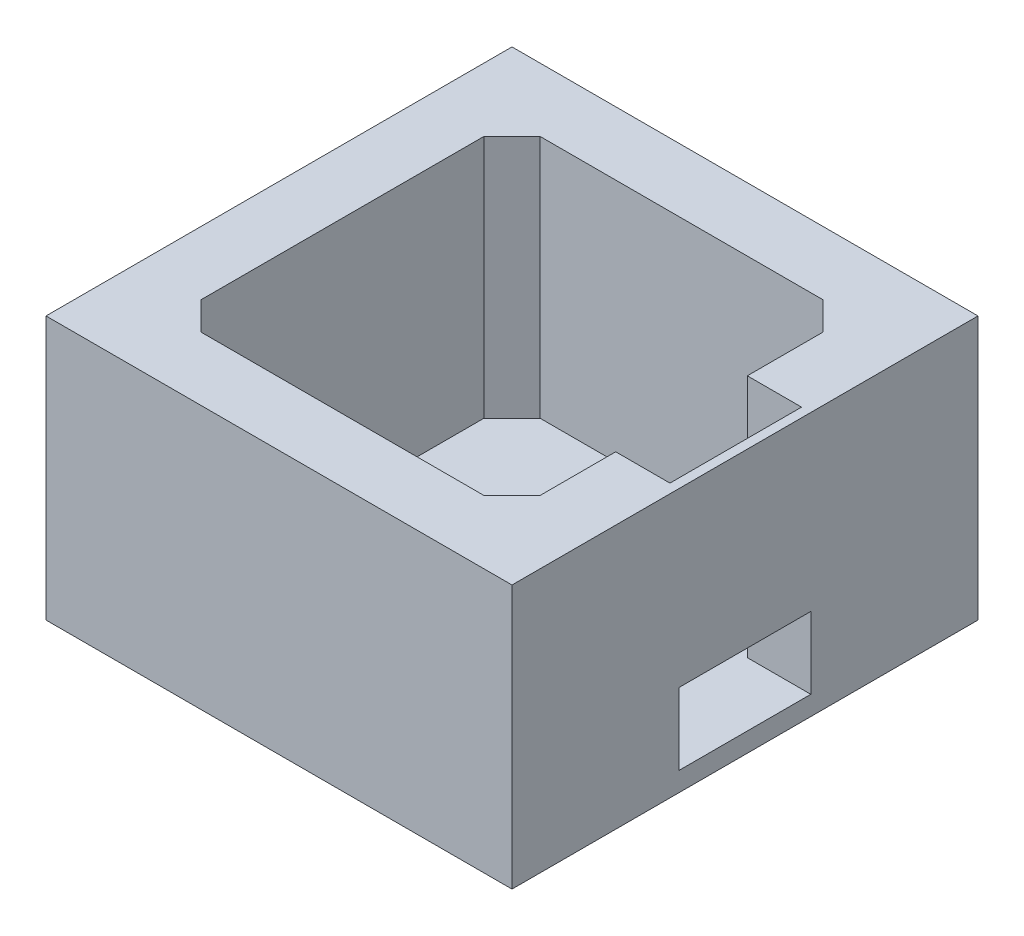
ISO-10303-21;
HEADER;
FILE_DESCRIPTION(('STEP AP214'),'2;1');
FILE_NAME('part.step','',(''),(''),'','','');
FILE_SCHEMA(('AUTOMOTIVE_DESIGN { 1 0 10303 214 1 1 1 1 }'));
ENDSEC;
DATA;
#1=APPLICATION_CONTEXT('core data for automotive mechanical design processes');
#2=APPLICATION_PROTOCOL_DEFINITION('international standard','automotive_design',2000,#1);
#3=PRODUCT_CONTEXT('',#1,'mechanical');
#4=PRODUCT('Part','Part','',(#3));
#5=PRODUCT_RELATED_PRODUCT_CATEGORY('part','',(#4));
#6=PRODUCT_DEFINITION_FORMATION('','',#4);
#7=PRODUCT_DEFINITION_CONTEXT('part definition',#1,'design');
#8=PRODUCT_DEFINITION('design','',#6,#7);
#9=PRODUCT_DEFINITION_SHAPE('','',#8);
#10=(LENGTH_UNIT() NAMED_UNIT(*) SI_UNIT(.MILLI.,.METRE.));
#11=(NAMED_UNIT(*) PLANE_ANGLE_UNIT() SI_UNIT($,.RADIAN.));
#12=(NAMED_UNIT(*) SI_UNIT($,.STERADIAN.) SOLID_ANGLE_UNIT());
#13=UNCERTAINTY_MEASURE_WITH_UNIT(LENGTH_MEASURE(1.E-05),#10,'distance_accuracy_value','');
#14=(GEOMETRIC_REPRESENTATION_CONTEXT(3) GLOBAL_UNCERTAINTY_ASSIGNED_CONTEXT((#13)) GLOBAL_UNIT_ASSIGNED_CONTEXT((#10,
#11,#12)) REPRESENTATION_CONTEXT('',''));
#15=CARTESIAN_POINT('',(0.,0.,0.));
#16=DIRECTION('',(0.,0.,1.));
#17=DIRECTION('',(1.,0.,0.));
#18=AXIS2_PLACEMENT_3D('',#15,#16,#17);
#19=CARTESIAN_POINT('',(0.,33.02,0.));
#20=DIRECTION('',(1.,0.,0.));
#21=DIRECTION('',(0.,0.,-1.));
#22=AXIS2_PLACEMENT_3D('',#19,#20,#21);
#23=PLANE('',#22);
#24=DIRECTION('',(0.,0.,1.));
#25=VECTOR('',#24,1.);
#26=CARTESIAN_POINT('',(0.,0.,0.));
#27=LINE('',#26,#25);
#28=CARTESIAN_POINT('',(0.,0.,-58.42));
#29=VERTEX_POINT('',#28);
#30=CARTESIAN_POINT('',(0.,0.,0.));
#31=VERTEX_POINT('',#30);
#32=EDGE_CURVE('E291',#29,#31,#27,.T.);
#33=ORIENTED_EDGE('',*,*,#32,.T.);
#34=DIRECTION('',(0.,-1.,0.));
#35=VECTOR('',#34,1.);
#36=CARTESIAN_POINT('',(0.,33.02,0.));
#37=LINE('',#36,#35);
#38=CARTESIAN_POINT('',(0.,33.02,0.));
#39=VERTEX_POINT('',#38);
#40=EDGE_CURVE('E11',#39,#31,#37,.T.);
#41=ORIENTED_EDGE('',*,*,#40,.F.);
#42=DIRECTION('',(0.,0.,1.));
#43=VECTOR('',#42,1.);
#44=CARTESIAN_POINT('',(0.,33.02,0.));
#45=LINE('',#44,#43);
#46=CARTESIAN_POINT('',(0.,33.02,-58.42));
#47=VERTEX_POINT('',#46);
#48=EDGE_CURVE('E323',#47,#39,#45,.T.);
#49=ORIENTED_EDGE('',*,*,#48,.F.);
#50=DIRECTION('',(0.,-1.,0.));
#51=VECTOR('',#50,1.);
#52=CARTESIAN_POINT('',(0.,33.02,-58.42));
#53=LINE('',#52,#51);
#54=EDGE_CURVE('E337',#47,#29,#53,.T.);
#55=ORIENTED_EDGE('',*,*,#54,.T.);
#56=EDGE_LOOP('',(#33,#41,#49,#55));
#57=FACE_BOUND('',#56,.T.);
#58=ADVANCED_FACE('F39',(#57),#23,.F.);
#59=CARTESIAN_POINT('',(0.,33.02,0.));
#60=DIRECTION('',(0.,0.,-1.));
#61=DIRECTION('',(-1.,0.,0.));
#62=AXIS2_PLACEMENT_3D('',#59,#60,#61);
#63=PLANE('',#62);
#64=DIRECTION('',(1.,0.,0.));
#65=VECTOR('',#64,1.);
#66=CARTESIAN_POINT('',(0.,0.,0.));
#67=LINE('',#66,#65);
#68=CARTESIAN_POINT('',(58.42,0.,0.));
#69=VERTEX_POINT('',#68);
#70=EDGE_CURVE('E341',#31,#69,#67,.T.);
#71=ORIENTED_EDGE('',*,*,#70,.T.);
#72=DIRECTION('',(0.,-1.,0.));
#73=VECTOR('',#72,1.);
#74=CARTESIAN_POINT('',(58.42,33.02,0.));
#75=LINE('',#74,#73);
#76=CARTESIAN_POINT('',(58.42,33.02,0.));
#77=VERTEX_POINT('',#76);
#78=EDGE_CURVE('E47',#77,#69,#75,.T.);
#79=ORIENTED_EDGE('',*,*,#78,.F.);
#80=DIRECTION('',(1.,0.,0.));
#81=VECTOR('',#80,1.);
#82=CARTESIAN_POINT('',(0.,33.02,0.));
#83=LINE('',#82,#81);
#84=EDGE_CURVE('E327',#39,#77,#83,.T.);
#85=ORIENTED_EDGE('',*,*,#84,.F.);
#86=ORIENTED_EDGE('',*,*,#40,.T.);
#87=EDGE_LOOP('',(#71,#79,#85,#86));
#88=FACE_BOUND('',#87,.T.);
#89=ADVANCED_FACE('F375',(#88),#63,.F.);
#90=CARTESIAN_POINT('',(58.42,33.02,0.));
#91=DIRECTION('',(-1.,0.,0.));
#92=DIRECTION('',(0.,0.,1.));
#93=AXIS2_PLACEMENT_3D('',#90,#91,#92);
#94=PLANE('',#93);
#95=DIRECTION('',(0.,0.,-1.));
#96=VECTOR('',#95,1.);
#97=CARTESIAN_POINT('',(58.42,2.419999986,-20.96));
#98=LINE('',#97,#96);
#99=CARTESIAN_POINT('',(58.42,2.419999986,-20.96));
#100=VERTEX_POINT('',#99);
#101=CARTESIAN_POINT('',(58.42,2.419999986,-37.46));
#102=VERTEX_POINT('',#101);
#103=EDGE_CURVE('E180',#100,#102,#98,.T.);
#104=ORIENTED_EDGE('',*,*,#103,.F.);
#105=DIRECTION('',(0.,-1.,0.));
#106=VECTOR('',#105,1.);
#107=CARTESIAN_POINT('',(58.42,11.419999986,-20.96));
#108=LINE('',#107,#106);
#109=CARTESIAN_POINT('',(58.42,11.419999986,-20.96));
#110=VERTEX_POINT('',#109);
#111=EDGE_CURVE('E185',#110,#100,#108,.T.);
#112=ORIENTED_EDGE('',*,*,#111,.F.);
#113=DIRECTION('',(0.,0.,1.));
#114=VECTOR('',#113,1.);
#115=CARTESIAN_POINT('',(58.42,11.419999986,-20.96));
#116=LINE('',#115,#114);
#117=CARTESIAN_POINT('',(58.42,11.419999986,-37.46));
#118=VERTEX_POINT('',#117);
#119=EDGE_CURVE('E190',#118,#110,#116,.T.);
#120=ORIENTED_EDGE('',*,*,#119,.F.);
#121=DIRECTION('',(0.,1.,0.));
#122=VECTOR('',#121,1.);
#123=CARTESIAN_POINT('',(58.42,11.419999986,-37.46));
#124=LINE('',#123,#122);
#125=EDGE_CURVE('E171',#102,#118,#124,.T.);
#126=ORIENTED_EDGE('',*,*,#125,.F.);
#127=EDGE_LOOP('',(#104,#112,#120,#126));
#128=FACE_BOUND('',#127,.T.);
#129=DIRECTION('',(0.,0.,-1.));
#130=VECTOR('',#129,1.);
#131=CARTESIAN_POINT('',(58.42,0.,0.));
#132=LINE('',#131,#130);
#133=CARTESIAN_POINT('',(58.42,0.,-58.42));
#134=VERTEX_POINT('',#133);
#135=EDGE_CURVE('E344',#69,#134,#132,.T.);
#136=ORIENTED_EDGE('',*,*,#135,.T.);
#137=DIRECTION('',(0.,-1.,0.));
#138=VECTOR('',#137,1.);
#139=CARTESIAN_POINT('',(58.42,33.02,-58.42));
#140=LINE('',#139,#138);
#141=CARTESIAN_POINT('',(58.42,33.02,-58.42));
#142=VERTEX_POINT('',#141);
#143=EDGE_CURVE('E352',#142,#134,#140,.T.);
#144=ORIENTED_EDGE('',*,*,#143,.F.);
#145=DIRECTION('',(0.,0.,-1.));
#146=VECTOR('',#145,1.);
#147=CARTESIAN_POINT('',(58.42,33.02,0.));
#148=LINE('',#147,#146);
#149=EDGE_CURVE('E331',#77,#142,#148,.T.);
#150=ORIENTED_EDGE('',*,*,#149,.F.);
#151=ORIENTED_EDGE('',*,*,#78,.T.);
#152=EDGE_LOOP('',(#136,#144,#150,#151));
#153=FACE_BOUND('',#152,.T.);
#154=ADVANCED_FACE('F187',(#128,#153),#94,.F.);
#155=CARTESIAN_POINT('',(0.,33.02,-58.42));
#156=DIRECTION('',(0.,0.,1.));
#157=DIRECTION('',(1.,0.,0.));
#158=AXIS2_PLACEMENT_3D('',#155,#156,#157);
#159=PLANE('',#158);
#160=DIRECTION('',(-1.,0.,0.));
#161=VECTOR('',#160,1.);
#162=CARTESIAN_POINT('',(0.,0.,-58.42));
#163=LINE('',#162,#161);
#164=EDGE_CURVE('E328',#134,#29,#163,.T.);
#165=ORIENTED_EDGE('',*,*,#164,.T.);
#166=ORIENTED_EDGE('',*,*,#54,.F.);
#167=DIRECTION('',(-1.,0.,0.));
#168=VECTOR('',#167,1.);
#169=CARTESIAN_POINT('',(0.,33.02,-58.42));
#170=LINE('',#169,#168);
#171=EDGE_CURVE('E334',#142,#47,#170,.T.);
#172=ORIENTED_EDGE('',*,*,#171,.F.);
#173=ORIENTED_EDGE('',*,*,#143,.T.);
#174=EDGE_LOOP('',(#165,#166,#172,#173));
#175=FACE_BOUND('',#174,.T.);
#176=ADVANCED_FACE('F368',(#175),#159,.F.);
#177=CARTESIAN_POINT('',(0.,33.02,0.));
#178=DIRECTION('',(0.,-1.,0.));
#179=DIRECTION('',(0.,0.,-1.));
#180=AXIS2_PLACEMENT_3D('',#177,#178,#179);
#181=PLANE('',#180);
#182=DIRECTION('',(0.,0.,1.));
#183=VECTOR('',#182,1.);
#184=CARTESIAN_POINT('',(7.95999999999998,33.02,-11.4955339059327));
#185=LINE('',#184,#183);
#186=CARTESIAN_POINT('',(7.95999999999998,33.02,-46.9244660940673));
#187=VERTEX_POINT('',#186);
#188=CARTESIAN_POINT('',(7.95999999999998,33.02,-11.4955339059327));
#189=VERTEX_POINT('',#188);
#190=EDGE_CURVE('E246',#187,#189,#185,.T.);
#191=ORIENTED_EDGE('',*,*,#190,.F.);
#192=DIRECTION('',(-0.707106781186549,0.,0.707106781186546));
#193=VECTOR('',#192,1.);
#194=CARTESIAN_POINT('',(7.95999999999998,33.02,-46.9244660940673));
#195=LINE('',#194,#193);
#196=CARTESIAN_POINT('',(11.4955339059327,33.02,-50.46));
#197=VERTEX_POINT('',#196);
#198=EDGE_CURVE('E62',#197,#187,#195,.T.);
#199=ORIENTED_EDGE('',*,*,#198,.F.);
#200=DIRECTION('',(-1.,0.,0.));
#201=VECTOR('',#200,1.);
#202=CARTESIAN_POINT('',(11.4955339059327,33.02,-50.46));
#203=LINE('',#202,#201);
#204=CARTESIAN_POINT('',(46.9244660940672,33.02,-50.46));
#205=VERTEX_POINT('',#204);
#206=EDGE_CURVE('E212',#205,#197,#203,.T.);
#207=ORIENTED_EDGE('',*,*,#206,.F.);
#208=DIRECTION('',(-0.707106781186546,0.,-0.707106781186549));
#209=VECTOR('',#208,1.);
#210=CARTESIAN_POINT('',(46.9244660940672,33.02,-50.46));
#211=LINE('',#210,#209);
#212=CARTESIAN_POINT('',(50.46,33.02,-46.9244660940672));
#213=VERTEX_POINT('',#212);
#214=EDGE_CURVE('E281',#213,#205,#211,.T.);
#215=ORIENTED_EDGE('',*,*,#214,.F.);
#216=DIRECTION('',(0.,0.,-1.));
#217=VECTOR('',#216,1.);
#218=CARTESIAN_POINT('',(50.46,33.02,-46.9244660940672));
#219=LINE('',#218,#217);
#220=CARTESIAN_POINT('',(50.46,33.02,-37.46));
#221=VERTEX_POINT('',#220);
#222=EDGE_CURVE('E277',#221,#213,#219,.T.);
#223=ORIENTED_EDGE('',*,*,#222,.F.);
#224=DIRECTION('',(-1.,0.,0.));
#225=VECTOR('',#224,1.);
#226=CARTESIAN_POINT('',(50.46,33.02,-37.46));
#227=LINE('',#226,#225);
#228=CARTESIAN_POINT('',(57.26,33.02,-37.46));
#229=VERTEX_POINT('',#228);
#230=EDGE_CURVE('E274',#229,#221,#227,.T.);
#231=ORIENTED_EDGE('',*,*,#230,.F.);
#232=DIRECTION('',(0.,0.,-1.));
#233=VECTOR('',#232,1.);
#234=CARTESIAN_POINT('',(57.26,33.02,-37.46));
#235=LINE('',#234,#233);
#236=CARTESIAN_POINT('',(57.26,33.02,-20.96));
#237=VERTEX_POINT('',#236);
#238=EDGE_CURVE('E270',#237,#229,#235,.T.);
#239=ORIENTED_EDGE('',*,*,#238,.F.);
#240=DIRECTION('',(1.,0.,0.));
#241=VECTOR('',#240,1.);
#242=CARTESIAN_POINT('',(50.46,33.02,-20.96));
#243=LINE('',#242,#241);
#244=CARTESIAN_POINT('',(50.46,33.02,-20.96));
#245=VERTEX_POINT('',#244);
#246=EDGE_CURVE('E266',#245,#237,#243,.T.);
#247=ORIENTED_EDGE('',*,*,#246,.F.);
#248=DIRECTION('',(0.,0.,-1.));
#249=VECTOR('',#248,1.);
#250=CARTESIAN_POINT('',(50.46,33.02,-20.96));
#251=LINE('',#250,#249);
#252=CARTESIAN_POINT('',(50.46,33.02,-11.4955339059327));
#253=VERTEX_POINT('',#252);
#254=EDGE_CURVE('E262',#253,#245,#251,.T.);
#255=ORIENTED_EDGE('',*,*,#254,.F.);
#256=DIRECTION('',(0.707106781186549,0.,-0.707106781186546));
#257=VECTOR('',#256,1.);
#258=CARTESIAN_POINT('',(50.46,33.02,-11.4955339059327));
#259=LINE('',#258,#257);
#260=CARTESIAN_POINT('',(46.9244660940672,33.02,-7.95999999999999));
#261=VERTEX_POINT('',#260);
#262=EDGE_CURVE('E258',#261,#253,#259,.T.);
#263=ORIENTED_EDGE('',*,*,#262,.F.);
#264=DIRECTION('',(1.,0.,0.));
#265=VECTOR('',#264,1.);
#266=CARTESIAN_POINT('',(46.9244660940672,33.02,-7.95999999999999));
#267=LINE('',#266,#265);
#268=CARTESIAN_POINT('',(11.4955339059327,33.02,-7.95999999999999));
#269=VERTEX_POINT('',#268);
#270=EDGE_CURVE('E254',#269,#261,#267,.T.);
#271=ORIENTED_EDGE('',*,*,#270,.F.);
#272=DIRECTION('',(0.707106781186549,0.,0.707106781186546));
#273=VECTOR('',#272,1.);
#274=CARTESIAN_POINT('',(11.4955339059327,33.02,-7.95999999999999));
#275=LINE('',#274,#273);
#276=EDGE_CURVE('E250',#189,#269,#275,.T.);
#277=ORIENTED_EDGE('',*,*,#276,.F.);
#278=EDGE_LOOP('',(#191,#199,#207,#215,#223,#231,#239,#247,#255,#263,#271,#277));
#279=FACE_BOUND('',#278,.T.);
#280=ORIENTED_EDGE('',*,*,#48,.T.);
#281=ORIENTED_EDGE('',*,*,#84,.T.);
#282=ORIENTED_EDGE('',*,*,#149,.T.);
#283=ORIENTED_EDGE('',*,*,#171,.T.);
#284=EDGE_LOOP('',(#280,#281,#282,#283));
#285=FACE_BOUND('',#284,.T.);
#286=ADVANCED_FACE('F374',(#279,#285),#181,.F.);
#287=CARTESIAN_POINT('',(0.,0.,0.));
#288=DIRECTION('',(0.,-1.,0.));
#289=DIRECTION('',(0.,0.,-1.));
#290=AXIS2_PLACEMENT_3D('',#287,#288,#289);
#291=PLANE('',#290);
#292=ORIENTED_EDGE('',*,*,#32,.F.);
#293=ORIENTED_EDGE('',*,*,#164,.F.);
#294=ORIENTED_EDGE('',*,*,#135,.F.);
#295=ORIENTED_EDGE('',*,*,#70,.F.);
#296=EDGE_LOOP('',(#292,#293,#294,#295));
#297=FACE_BOUND('',#296,.T.);
#298=ADVANCED_FACE('F365',(#297),#291,.T.);
#299=CARTESIAN_POINT('',(7.95999999999998,2.419999986,-46.9244660940673));
#300=DIRECTION('',(-0.707106781186546,0.,-0.707106781186549));
#301=DIRECTION('',(-0.707106781186549,0.,0.707106781186546));
#302=AXIS2_PLACEMENT_3D('',#299,#300,#301);
#303=PLANE('',#302);
#304=ORIENTED_EDGE('',*,*,#198,.T.);
#305=DIRECTION('',(0.,1.,0.));
#306=VECTOR('',#305,1.);
#307=CARTESIAN_POINT('',(7.95999999999998,2.419999986,-46.9244660940673));
#308=LINE('',#307,#306);
#309=CARTESIAN_POINT('',(7.95999999999998,2.419999986,-46.9244660940673));
#310=VERTEX_POINT('',#309);
#311=EDGE_CURVE('E243',#310,#187,#308,.T.);
#312=ORIENTED_EDGE('',*,*,#311,.F.);
#313=DIRECTION('',(-0.707106781186549,0.,0.707106781186546));
#314=VECTOR('',#313,1.);
#315=CARTESIAN_POINT('',(7.95999999999998,2.419999986,-46.9244660940673));
#316=LINE('',#315,#314);
#317=CARTESIAN_POINT('',(11.4955339059327,2.419999986,-50.46));
#318=VERTEX_POINT('',#317);
#319=EDGE_CURVE('E207',#318,#310,#316,.T.);
#320=ORIENTED_EDGE('',*,*,#319,.F.);
#321=DIRECTION('',(0.,1.,0.));
#322=VECTOR('',#321,1.);
#323=CARTESIAN_POINT('',(11.4955339059327,2.419999986,-50.46));
#324=LINE('',#323,#322);
#325=EDGE_CURVE('E288',#318,#197,#324,.T.);
#326=ORIENTED_EDGE('',*,*,#325,.T.);
#327=EDGE_LOOP('',(#304,#312,#320,#326));
#328=FACE_BOUND('',#327,.T.);
#329=ADVANCED_FACE('F387',(#328),#303,.F.);
#330=CARTESIAN_POINT('',(11.4955339059327,2.419999986,-50.46));
#331=DIRECTION('',(0.,0.,-1.));
#332=DIRECTION('',(-1.,0.,0.));
#333=AXIS2_PLACEMENT_3D('',#330,#331,#332);
#334=PLANE('',#333);
#335=ORIENTED_EDGE('',*,*,#206,.T.);
#336=ORIENTED_EDGE('',*,*,#325,.F.);
#337=DIRECTION('',(-1.,0.,0.));
#338=VECTOR('',#337,1.);
#339=CARTESIAN_POINT('',(11.4955339059327,2.419999986,-50.46));
#340=LINE('',#339,#338);
#341=CARTESIAN_POINT('',(46.9244660940672,2.419999986,-50.46));
#342=VERTEX_POINT('',#341);
#343=EDGE_CURVE('E239',#342,#318,#340,.T.);
#344=ORIENTED_EDGE('',*,*,#343,.F.);
#345=DIRECTION('',(0.,1.,0.));
#346=VECTOR('',#345,1.);
#347=CARTESIAN_POINT('',(46.9244660940672,2.419999986,-50.46));
#348=LINE('',#347,#346);
#349=EDGE_CURVE('E292',#342,#205,#348,.T.);
#350=ORIENTED_EDGE('',*,*,#349,.T.);
#351=EDGE_LOOP('',(#335,#336,#344,#350));
#352=FACE_BOUND('',#351,.T.);
#353=ADVANCED_FACE('F393',(#352),#334,.F.);
#354=CARTESIAN_POINT('',(46.9244660940672,2.419999986,-50.46));
#355=DIRECTION('',(0.707106781186549,0.,-0.707106781186546));
#356=DIRECTION('',(-0.707106781186546,0.,-0.707106781186549));
#357=AXIS2_PLACEMENT_3D('',#354,#355,#356);
#358=PLANE('',#357);
#359=ORIENTED_EDGE('',*,*,#214,.T.);
#360=ORIENTED_EDGE('',*,*,#349,.F.);
#361=DIRECTION('',(-0.707106781186546,0.,-0.707106781186549));
#362=VECTOR('',#361,1.);
#363=CARTESIAN_POINT('',(46.9244660940672,2.419999986,-50.46));
#364=LINE('',#363,#362);
#365=CARTESIAN_POINT('',(50.46,2.419999986,-46.9244660940672));
#366=VERTEX_POINT('',#365);
#367=EDGE_CURVE('E235',#366,#342,#364,.T.);
#368=ORIENTED_EDGE('',*,*,#367,.F.);
#369=DIRECTION('',(0.,1.,0.));
#370=VECTOR('',#369,1.);
#371=CARTESIAN_POINT('',(50.46,2.419999986,-46.9244660940672));
#372=LINE('',#371,#370);
#373=EDGE_CURVE('E295',#366,#213,#372,.T.);
#374=ORIENTED_EDGE('',*,*,#373,.T.);
#375=EDGE_LOOP('',(#359,#360,#368,#374));
#376=FACE_BOUND('',#375,.T.);
#377=ADVANCED_FACE('F427',(#376),#358,.F.);
#378=CARTESIAN_POINT('',(50.46,2.419999986,-46.9244660940672));
#379=DIRECTION('',(1.,0.,0.));
#380=DIRECTION('',(0.,0.,-1.));
#381=AXIS2_PLACEMENT_3D('',#378,#379,#380);
#382=PLANE('',#381);
#383=ORIENTED_EDGE('',*,*,#222,.T.);
#384=ORIENTED_EDGE('',*,*,#373,.F.);
#385=DIRECTION('',(0.,0.,-1.));
#386=VECTOR('',#385,1.);
#387=CARTESIAN_POINT('',(50.46,2.419999986,-46.9244660940672));
#388=LINE('',#387,#386);
#389=CARTESIAN_POINT('',(50.46,2.419999986,-37.46));
#390=VERTEX_POINT('',#389);
#391=EDGE_CURVE('E177',#390,#366,#388,.T.);
#392=ORIENTED_EDGE('',*,*,#391,.F.);
#393=DIRECTION('',(0.,1.,0.));
#394=VECTOR('',#393,1.);
#395=CARTESIAN_POINT('',(50.46,2.419999986,-37.46));
#396=LINE('',#395,#394);
#397=EDGE_CURVE('E173',#390,#221,#396,.T.);
#398=ORIENTED_EDGE('',*,*,#397,.T.);
#399=EDGE_LOOP('',(#383,#384,#392,#398));
#400=FACE_BOUND('',#399,.T.);
#401=ADVANCED_FACE('F424',(#400),#382,.F.);
#402=CARTESIAN_POINT('',(50.46,2.419999986,-37.46));
#403=DIRECTION('',(0.,0.,-1.));
#404=DIRECTION('',(-1.,0.,0.));
#405=AXIS2_PLACEMENT_3D('',#402,#403,#404);
#406=PLANE('',#405);
#407=ORIENTED_EDGE('',*,*,#230,.T.);
#408=ORIENTED_EDGE('',*,*,#397,.F.);
#409=DIRECTION('',(-1.,0.,0.));
#410=VECTOR('',#409,1.);
#411=CARTESIAN_POINT('',(50.46,2.419999986,-37.46));
#412=LINE('',#411,#410);
#413=EDGE_CURVE('E166',#102,#390,#412,.T.);
#414=ORIENTED_EDGE('',*,*,#413,.F.);
#415=ORIENTED_EDGE('',*,*,#125,.T.);
#416=DIRECTION('',(1.,0.,0.));
#417=VECTOR('',#416,1.);
#418=CARTESIAN_POINT('',(27.819999986,11.419999986,-37.46));
#419=LINE('',#418,#417);
#420=CARTESIAN_POINT('',(57.26,11.419999986,-37.46));
#421=VERTEX_POINT('',#420);
#422=EDGE_CURVE('E194',#421,#118,#419,.T.);
#423=ORIENTED_EDGE('',*,*,#422,.F.);
#424=DIRECTION('',(0.,1.,0.));
#425=VECTOR('',#424,1.);
#426=CARTESIAN_POINT('',(57.26,2.419999986,-37.46));
#427=LINE('',#426,#425);
#428=EDGE_CURVE('E300',#421,#229,#427,.T.);
#429=ORIENTED_EDGE('',*,*,#428,.T.);
#430=EDGE_LOOP('',(#407,#408,#414,#415,#423,#429));
#431=FACE_BOUND('',#430,.T.);
#432=ADVANCED_FACE('F168',(#431),#406,.F.);
#433=CARTESIAN_POINT('',(57.26,2.419999986,-37.46));
#434=DIRECTION('',(1.,0.,0.));
#435=DIRECTION('',(0.,0.,-1.));
#436=AXIS2_PLACEMENT_3D('',#433,#434,#435);
#437=PLANE('',#436);
#438=ORIENTED_EDGE('',*,*,#428,.F.);
#439=DIRECTION('',(0.,0.,1.));
#440=VECTOR('',#439,1.);
#441=CARTESIAN_POINT('',(57.26,11.419999986,-37.46));
#442=LINE('',#441,#440);
#443=CARTESIAN_POINT('',(57.26,11.419999986,-20.96));
#444=VERTEX_POINT('',#443);
#445=EDGE_CURVE('E201',#421,#444,#442,.T.);
#446=ORIENTED_EDGE('',*,*,#445,.T.);
#447=DIRECTION('',(0.,1.,0.));
#448=VECTOR('',#447,1.);
#449=CARTESIAN_POINT('',(57.26,2.419999986,-20.96));
#450=LINE('',#449,#448);
#451=EDGE_CURVE('E303',#444,#237,#450,.T.);
#452=ORIENTED_EDGE('',*,*,#451,.T.);
#453=ORIENTED_EDGE('',*,*,#238,.T.);
#454=EDGE_LOOP('',(#438,#446,#452,#453));
#455=FACE_BOUND('',#454,.T.);
#456=ADVANCED_FACE('F417',(#455),#437,.F.);
#457=CARTESIAN_POINT('',(50.46,2.419999986,-20.96));
#458=DIRECTION('',(0.,0.,1.));
#459=DIRECTION('',(1.,0.,0.));
#460=AXIS2_PLACEMENT_3D('',#457,#458,#459);
#461=PLANE('',#460);
#462=ORIENTED_EDGE('',*,*,#451,.F.);
#463=DIRECTION('',(1.,0.,0.));
#464=VECTOR('',#463,1.);
#465=CARTESIAN_POINT('',(27.819999986,11.419999986,-20.96));
#466=LINE('',#465,#464);
#467=EDGE_CURVE('E198',#444,#110,#466,.T.);
#468=ORIENTED_EDGE('',*,*,#467,.T.);
#469=ORIENTED_EDGE('',*,*,#111,.T.);
#470=DIRECTION('',(1.,0.,0.));
#471=VECTOR('',#470,1.);
#472=CARTESIAN_POINT('',(50.46,2.419999986,-20.96));
#473=LINE('',#472,#471);
#474=CARTESIAN_POINT('',(50.46,2.419999986,-20.96));
#475=VERTEX_POINT('',#474);
#476=EDGE_CURVE('E54',#475,#100,#473,.T.);
#477=ORIENTED_EDGE('',*,*,#476,.F.);
#478=DIRECTION('',(0.,1.,0.));
#479=VECTOR('',#478,1.);
#480=CARTESIAN_POINT('',(50.46,2.419999986,-20.96));
#481=LINE('',#480,#479);
#482=EDGE_CURVE('E306',#475,#245,#481,.T.);
#483=ORIENTED_EDGE('',*,*,#482,.T.);
#484=ORIENTED_EDGE('',*,*,#246,.T.);
#485=EDGE_LOOP('',(#462,#468,#469,#477,#483,#484));
#486=FACE_BOUND('',#485,.T.);
#487=ADVANCED_FACE('F413',(#486),#461,.F.);
#488=CARTESIAN_POINT('',(50.46,2.419999986,-20.96));
#489=DIRECTION('',(1.,0.,0.));
#490=DIRECTION('',(0.,0.,-1.));
#491=AXIS2_PLACEMENT_3D('',#488,#489,#490);
#492=PLANE('',#491);
#493=ORIENTED_EDGE('',*,*,#254,.T.);
#494=ORIENTED_EDGE('',*,*,#482,.F.);
#495=DIRECTION('',(0.,0.,-1.));
#496=VECTOR('',#495,1.);
#497=CARTESIAN_POINT('',(50.46,2.419999986,-20.96));
#498=LINE('',#497,#496);
#499=CARTESIAN_POINT('',(50.46,2.419999986,-11.4955339059327));
#500=VERTEX_POINT('',#499);
#501=EDGE_CURVE('E228',#500,#475,#498,.T.);
#502=ORIENTED_EDGE('',*,*,#501,.F.);
#503=DIRECTION('',(0.,1.,0.));
#504=VECTOR('',#503,1.);
#505=CARTESIAN_POINT('',(50.46,2.419999986,-11.4955339059327));
#506=LINE('',#505,#504);
#507=EDGE_CURVE('E309',#500,#253,#506,.T.);
#508=ORIENTED_EDGE('',*,*,#507,.T.);
#509=EDGE_LOOP('',(#493,#494,#502,#508));
#510=FACE_BOUND('',#509,.T.);
#511=ADVANCED_FACE('F409',(#510),#492,.F.);
#512=CARTESIAN_POINT('',(50.46,2.419999986,-11.4955339059327));
#513=DIRECTION('',(0.707106781186546,0.,0.707106781186549));
#514=DIRECTION('',(0.707106781186549,0.,-0.707106781186546));
#515=AXIS2_PLACEMENT_3D('',#512,#513,#514);
#516=PLANE('',#515);
#517=ORIENTED_EDGE('',*,*,#262,.T.);
#518=ORIENTED_EDGE('',*,*,#507,.F.);
#519=DIRECTION('',(0.707106781186549,0.,-0.707106781186546));
#520=VECTOR('',#519,1.);
#521=CARTESIAN_POINT('',(50.46,2.419999986,-11.4955339059327));
#522=LINE('',#521,#520);
#523=CARTESIAN_POINT('',(46.9244660940672,2.419999986,-7.95999999999999));
#524=VERTEX_POINT('',#523);
#525=EDGE_CURVE('E224',#524,#500,#522,.T.);
#526=ORIENTED_EDGE('',*,*,#525,.F.);
#527=DIRECTION('',(0.,1.,0.));
#528=VECTOR('',#527,1.);
#529=CARTESIAN_POINT('',(46.9244660940672,2.419999986,-7.95999999999999));
#530=LINE('',#529,#528);
#531=EDGE_CURVE('E312',#524,#261,#530,.T.);
#532=ORIENTED_EDGE('',*,*,#531,.T.);
#533=EDGE_LOOP('',(#517,#518,#526,#532));
#534=FACE_BOUND('',#533,.T.);
#535=ADVANCED_FACE('F405',(#534),#516,.F.);
#536=CARTESIAN_POINT('',(46.9244660940672,2.419999986,-7.95999999999999));
#537=DIRECTION('',(0.,0.,1.));
#538=DIRECTION('',(1.,0.,0.));
#539=AXIS2_PLACEMENT_3D('',#536,#537,#538);
#540=PLANE('',#539);
#541=ORIENTED_EDGE('',*,*,#270,.T.);
#542=ORIENTED_EDGE('',*,*,#531,.F.);
#543=DIRECTION('',(1.,0.,0.));
#544=VECTOR('',#543,1.);
#545=CARTESIAN_POINT('',(46.9244660940672,2.419999986,-7.95999999999999));
#546=LINE('',#545,#544);
#547=CARTESIAN_POINT('',(11.4955339059327,2.419999986,-7.95999999999999));
#548=VERTEX_POINT('',#547);
#549=EDGE_CURVE('E220',#548,#524,#546,.T.);
#550=ORIENTED_EDGE('',*,*,#549,.F.);
#551=DIRECTION('',(0.,1.,0.));
#552=VECTOR('',#551,1.);
#553=CARTESIAN_POINT('',(11.4955339059327,2.419999986,-7.95999999999999));
#554=LINE('',#553,#552);
#555=EDGE_CURVE('E315',#548,#269,#554,.T.);
#556=ORIENTED_EDGE('',*,*,#555,.T.);
#557=EDGE_LOOP('',(#541,#542,#550,#556));
#558=FACE_BOUND('',#557,.T.);
#559=ADVANCED_FACE('F401',(#558),#540,.F.);
#560=CARTESIAN_POINT('',(11.4955339059327,2.419999986,-7.95999999999999));
#561=DIRECTION('',(-0.707106781186546,0.,0.707106781186549));
#562=DIRECTION('',(0.707106781186549,0.,0.707106781186546));
#563=AXIS2_PLACEMENT_3D('',#560,#561,#562);
#564=PLANE('',#563);
#565=ORIENTED_EDGE('',*,*,#276,.T.);
#566=ORIENTED_EDGE('',*,*,#555,.F.);
#567=DIRECTION('',(0.707106781186549,0.,0.707106781186546));
#568=VECTOR('',#567,1.);
#569=CARTESIAN_POINT('',(11.4955339059327,2.419999986,-7.95999999999999));
#570=LINE('',#569,#568);
#571=CARTESIAN_POINT('',(7.95999999999998,2.419999986,-11.4955339059327));
#572=VERTEX_POINT('',#571);
#573=EDGE_CURVE('E216',#572,#548,#570,.T.);
#574=ORIENTED_EDGE('',*,*,#573,.F.);
#575=DIRECTION('',(0.,1.,0.));
#576=VECTOR('',#575,1.);
#577=CARTESIAN_POINT('',(7.95999999999998,2.419999986,-11.4955339059327));
#578=LINE('',#577,#576);
#579=EDGE_CURVE('E318',#572,#189,#578,.T.);
#580=ORIENTED_EDGE('',*,*,#579,.T.);
#581=EDGE_LOOP('',(#565,#566,#574,#580));
#582=FACE_BOUND('',#581,.T.);
#583=ADVANCED_FACE('F397',(#582),#564,.F.);
#584=CARTESIAN_POINT('',(7.95999999999998,2.419999986,-11.4955339059327));
#585=DIRECTION('',(-1.,0.,0.));
#586=DIRECTION('',(0.,0.,1.));
#587=AXIS2_PLACEMENT_3D('',#584,#585,#586);
#588=PLANE('',#587);
#589=ORIENTED_EDGE('',*,*,#190,.T.);
#590=ORIENTED_EDGE('',*,*,#579,.F.);
#591=DIRECTION('',(0.,0.,1.));
#592=VECTOR('',#591,1.);
#593=CARTESIAN_POINT('',(7.95999999999998,2.419999986,-11.4955339059327));
#594=LINE('',#593,#592);
#595=EDGE_CURVE('E211',#310,#572,#594,.T.);
#596=ORIENTED_EDGE('',*,*,#595,.F.);
#597=ORIENTED_EDGE('',*,*,#311,.T.);
#598=EDGE_LOOP('',(#589,#590,#596,#597));
#599=FACE_BOUND('',#598,.T.);
#600=ADVANCED_FACE('F394',(#599),#588,.F.);
#601=CARTESIAN_POINT('',(0.,2.419999986,0.));
#602=DIRECTION('',(0.,-1.,0.));
#603=DIRECTION('',(0.,0.,-1.));
#604=AXIS2_PLACEMENT_3D('',#601,#602,#603);
#605=PLANE('',#604);
#606=ORIENTED_EDGE('',*,*,#413,.T.);
#607=ORIENTED_EDGE('',*,*,#391,.T.);
#608=ORIENTED_EDGE('',*,*,#367,.T.);
#609=ORIENTED_EDGE('',*,*,#343,.T.);
#610=ORIENTED_EDGE('',*,*,#319,.T.);
#611=ORIENTED_EDGE('',*,*,#595,.T.);
#612=ORIENTED_EDGE('',*,*,#573,.T.);
#613=ORIENTED_EDGE('',*,*,#549,.T.);
#614=ORIENTED_EDGE('',*,*,#525,.T.);
#615=ORIENTED_EDGE('',*,*,#501,.T.);
#616=ORIENTED_EDGE('',*,*,#476,.T.);
#617=ORIENTED_EDGE('',*,*,#103,.T.);
#618=EDGE_LOOP('',(#606,#607,#608,#609,#610,#611,#612,#613,#614,#615,#616,#617));
#619=FACE_BOUND('',#618,.T.);
#620=ADVANCED_FACE('F181',(#619),#605,.F.);
#621=CARTESIAN_POINT('',(27.819999986,11.419999986,-20.96));
#622=DIRECTION('',(0.,1.,0.));
#623=DIRECTION('',(0.,0.,1.));
#624=AXIS2_PLACEMENT_3D('',#621,#622,#623);
#625=PLANE('',#624);
#626=ORIENTED_EDGE('',*,*,#422,.T.);
#627=ORIENTED_EDGE('',*,*,#119,.T.);
#628=ORIENTED_EDGE('',*,*,#467,.F.);
#629=ORIENTED_EDGE('',*,*,#445,.F.);
#630=EDGE_LOOP('',(#626,#627,#628,#629));
#631=FACE_BOUND('',#630,.T.);
#632=ADVANCED_FACE('F437',(#631),#625,.F.);
#633=CLOSED_SHELL('',(#58,#89,#154,#176,#286,#298,#329,#353,#377,#401,#432,#456,#487,#511,#535,
#559,#583,#600,#620,#632));
#634=MANIFOLD_SOLID_BREP('B2',#633);
#635=ADVANCED_BREP_SHAPE_REPRESENTATION('',(#18,#634),#14);
#636=SHAPE_DEFINITION_REPRESENTATION(#9,#635);
ENDSEC;
END-ISO-10303-21;
